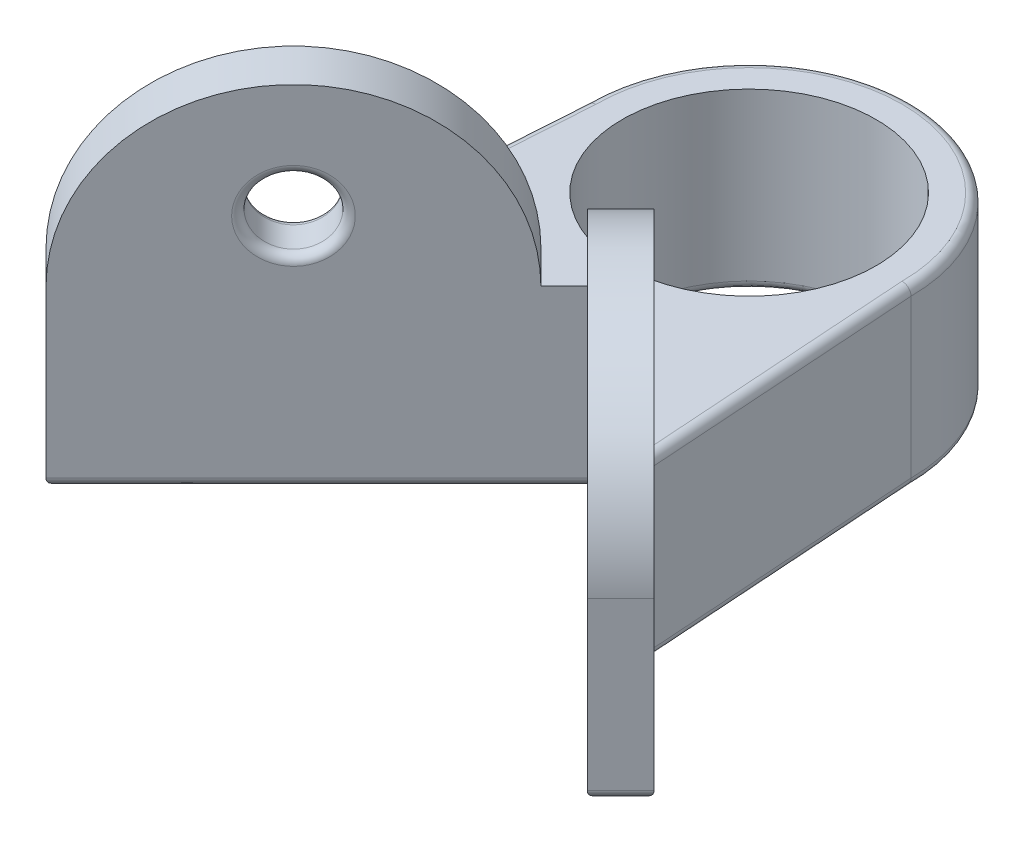
ISO-10303-21;
HEADER;
FILE_DESCRIPTION(('STEP AP214'),'2;1');
FILE_NAME('part.step','',(''),(''),'','','');
FILE_SCHEMA(('AUTOMOTIVE_DESIGN { 1 0 10303 214 1 1 1 1 }'));
ENDSEC;
DATA;
#1=APPLICATION_CONTEXT('core data for automotive mechanical design processes');
#2=APPLICATION_PROTOCOL_DEFINITION('international standard','automotive_design',2000,#1);
#3=PRODUCT_CONTEXT('',#1,'mechanical');
#4=PRODUCT('Part','Part','',(#3));
#5=PRODUCT_RELATED_PRODUCT_CATEGORY('part','',(#4));
#6=PRODUCT_DEFINITION_FORMATION('','',#4);
#7=PRODUCT_DEFINITION_CONTEXT('part definition',#1,'design');
#8=PRODUCT_DEFINITION('design','',#6,#7);
#9=PRODUCT_DEFINITION_SHAPE('','',#8);
#10=(LENGTH_UNIT() NAMED_UNIT(*) SI_UNIT(.MILLI.,.METRE.));
#11=(NAMED_UNIT(*) PLANE_ANGLE_UNIT() SI_UNIT($,.RADIAN.));
#12=(NAMED_UNIT(*) SI_UNIT($,.STERADIAN.) SOLID_ANGLE_UNIT());
#13=UNCERTAINTY_MEASURE_WITH_UNIT(LENGTH_MEASURE(1.E-05),#10,'distance_accuracy_value','');
#14=(GEOMETRIC_REPRESENTATION_CONTEXT(3) GLOBAL_UNCERTAINTY_ASSIGNED_CONTEXT((#13)) GLOBAL_UNIT_ASSIGNED_CONTEXT((#10,
#11,#12)) REPRESENTATION_CONTEXT('',''));
#15=CARTESIAN_POINT('',(0.,0.,0.));
#16=DIRECTION('',(0.,0.,1.));
#17=DIRECTION('',(1.,0.,0.));
#18=AXIS2_PLACEMENT_3D('',#15,#16,#17);
#19=CARTESIAN_POINT('',(-9.25,0.,9.25000000000004));
#20=DIRECTION('',(-0.707106781186546,0.,0.707106781186549));
#21=DIRECTION('',(0.707106781186549,0.,0.707106781186546));
#22=AXIS2_PLACEMENT_3D('',#19,#20,#21);
#23=PLANE('',#22);
#24=CARTESIAN_POINT('',(16.7907185903655,27.,35.2907185903655));
#25=DIRECTION('',(-0.707106781186546,0.,0.707106781186549));
#26=DIRECTION('',(0.707106781186549,0.,0.707106781186546));
#27=AXIS2_PLACEMENT_3D('',#24,#25,#26);
#28=CIRCLE('',#27,5.);
#29=CARTESIAN_POINT('',(20.3262524962983,27.,38.8262524962982));
#30=VERTEX_POINT('',#29);
#31=EDGE_CURVE('E93',#30,#30,#28,.F.);
#32=ORIENTED_EDGE('',*,*,#31,.T.);
#33=EDGE_LOOP('',(#32));
#34=FACE_BOUND('',#33,.T.);
#35=DIRECTION('',(0.,1.,0.));
#36=VECTOR('',#35,1.);
#37=CARTESIAN_POINT('',(0.,0.,18.5));
#38=LINE('',#37,#36);
#39=CARTESIAN_POINT('',(0.,1.,18.5));
#40=VERTEX_POINT('',#39);
#41=CARTESIAN_POINT('',(0.,20.,18.5));
#42=VERTEX_POINT('',#41);
#43=EDGE_CURVE('E567',#40,#42,#38,.T.);
#44=ORIENTED_EDGE('',*,*,#43,.F.);
#45=DIRECTION('',(0.707106781186549,0.,0.707106781186546));
#46=VECTOR('',#45,1.);
#47=CARTESIAN_POINT('',(30.9328542140965,1.,49.4328542140964));
#48=LINE('',#47,#46);
#49=CARTESIAN_POINT('',(30.9328542140965,1.,49.4328542140964));
#50=VERTEX_POINT('',#49);
#51=EDGE_CURVE('E529',#40,#50,#48,.T.);
#52=ORIENTED_EDGE('',*,*,#51,.T.);
#53=DIRECTION('',(0.,1.,0.));
#54=VECTOR('',#53,1.);
#55=CARTESIAN_POINT('',(30.9328542140965,0.,49.4328542140964));
#56=LINE('',#55,#54);
#57=CARTESIAN_POINT('',(30.9328542140965,20.,49.4328542140964));
#58=VERTEX_POINT('',#57);
#59=EDGE_CURVE('E609',#50,#58,#56,.T.);
#60=ORIENTED_EDGE('',*,*,#59,.T.);
#61=CARTESIAN_POINT('',(16.8129092861663,20.,35.3129092861663));
#62=DIRECTION('',(-0.707106781186546,0.,0.707106781186549));
#63=DIRECTION('',(0.707106781186549,0.,0.707106781186546));
#64=AXIS2_PLACEMENT_3D('',#61,#62,#63);
#65=CIRCLE('',#64,19.96861761704);
#66=CARTESIAN_POINT('',(2.69296435823619,20.,21.1929643582362));
#67=VERTEX_POINT('',#66);
#68=EDGE_CURVE('E480',#58,#67,#65,.T.);
#69=ORIENTED_EDGE('',*,*,#68,.T.);
#70=DIRECTION('',(0.707106781186548,0.,0.707106781186547));
#71=VECTOR('',#70,1.);
#72=CARTESIAN_POINT('',(0.,20.,18.5));
#73=LINE('',#72,#71);
#74=EDGE_CURVE('E235',#42,#67,#73,.T.);
#75=ORIENTED_EDGE('',*,*,#74,.F.);
#76=EDGE_LOOP('',(#44,#52,#60,#69,#75));
#77=FACE_BOUND('',#76,.T.);
#78=ADVANCED_FACE('F85',(#34,#77),#23,.T.);
#79=CARTESIAN_POINT('',(9.25,0.,9.25000000000003));
#80=DIRECTION('',(-0.707106781186546,0.,-0.707106781186549));
#81=DIRECTION('',(-0.707106781186549,0.,0.707106781186546));
#82=AXIS2_PLACEMENT_3D('',#79,#80,#81);
#83=PLANE('',#82);
#84=CARTESIAN_POINT('',(-16.7907185903655,26.9488438876536,35.2907185903655));
#85=DIRECTION('',(-0.707106781186546,0.,-0.707106781186549));
#86=DIRECTION('',(-0.707106781186549,0.,0.707106781186546));
#87=AXIS2_PLACEMENT_3D('',#84,#85,#86);
#88=CIRCLE('',#87,5.);
#89=CARTESIAN_POINT('',(-20.3262524962983,26.9488438876536,38.8262524962982));
#90=VERTEX_POINT('',#89);
#91=EDGE_CURVE('E422',#90,#90,#88,.T.);
#92=ORIENTED_EDGE('',*,*,#91,.T.);
#93=EDGE_LOOP('',(#92));
#94=FACE_BOUND('',#93,.T.);
#95=DIRECTION('',(0.,1.,0.));
#96=VECTOR('',#95,1.);
#97=CARTESIAN_POINT('',(-30.9328542140965,0.,49.4328542140964));
#98=LINE('',#97,#96);
#99=CARTESIAN_POINT('',(-30.9328542140965,1.,49.4328542140964));
#100=VERTEX_POINT('',#99);
#101=CARTESIAN_POINT('',(-30.9328542140965,19.9488438876536,49.4328542140964));
#102=VERTEX_POINT('',#101);
#103=EDGE_CURVE('E565',#100,#102,#98,.T.);
#104=ORIENTED_EDGE('',*,*,#103,.F.);
#105=DIRECTION('',(-0.707106781186549,0.,0.707106781186546));
#106=VECTOR('',#105,1.);
#107=CARTESIAN_POINT('',(9.25,1.,9.25000000000003));
#108=LINE('',#107,#106);
#109=EDGE_CURVE('E527',#100,#40,#108,.F.);
#110=ORIENTED_EDGE('',*,*,#109,.T.);
#111=ORIENTED_EDGE('',*,*,#43,.T.);
#112=DIRECTION('',(0.707106781186548,0.,-0.707106781186547));
#113=VECTOR('',#112,1.);
#114=CARTESIAN_POINT('',(-2.64858296663456,20.,21.1485829666346));
#115=LINE('',#114,#113);
#116=CARTESIAN_POINT('',(-2.64858296663456,20.,21.1485829666346));
#117=VERTEX_POINT('',#116);
#118=EDGE_CURVE('E245',#117,#42,#115,.T.);
#119=ORIENTED_EDGE('',*,*,#118,.F.);
#120=DIRECTION('',(0.,-1.,0.));
#121=VECTOR('',#120,1.);
#122=CARTESIAN_POINT('',(-2.64858296663456,0.,21.1485829666345));
#123=LINE('',#122,#121);
#124=CARTESIAN_POINT('',(-2.64858296663456,19.9488438876536,21.1485829666345));
#125=VERTEX_POINT('',#124);
#126=EDGE_CURVE('E570',#117,#125,#123,.T.);
#127=ORIENTED_EDGE('',*,*,#126,.T.);
#128=CARTESIAN_POINT('',(-16.7907185903655,19.9488438876536,35.2907185903655));
#129=DIRECTION('',(-0.707106781186546,0.,-0.707106781186549));
#130=DIRECTION('',(-0.707106781186549,0.,0.707106781186546));
#131=AXIS2_PLACEMENT_3D('',#128,#129,#130);
#132=CIRCLE('',#131,20.);
#133=EDGE_CURVE('E263',#125,#102,#132,.F.);
#134=ORIENTED_EDGE('',*,*,#133,.T.);
#135=EDGE_LOOP('',(#104,#110,#111,#119,#127,#134));
#136=FACE_BOUND('',#135,.T.);
#137=ADVANCED_FACE('F301',(#94,#136),#83,.F.);
#138=CARTESIAN_POINT('',(7.67942640343322,19.9488438876536,31.4765923367024));
#139=DIRECTION('',(0.707106781186549,0.,-0.707106781186546));
#140=DIRECTION('',(-0.707106781186546,0.,-0.707106781186549));
#141=AXIS2_PLACEMENT_3D('',#138,#139,#140);
#142=PLANE('',#141);
#143=DIRECTION('',(0.707106781186546,0.,0.707106781186549));
#144=VECTOR('',#143,1.);
#145=CARTESIAN_POINT('',(-6.46270922029771,20.,17.3344567129714));
#146=LINE('',#145,#144);
#147=CARTESIAN_POINT('',(-6.46273235110501,20.,17.3344798437787));
#148=VERTEX_POINT('',#147);
#149=EDGE_CURVE('E483',#148,#117,#146,.T.);
#150=ORIENTED_EDGE('',*,*,#149,.F.);
#151=CARTESIAN_POINT('',(-6.46270922029771,20.,17.3344567129714));
#152=DIRECTION('',(0.,-1.,0.));
#153=VECTOR('',#152,1.);
#154=LINE('',#151,#153);
#155=CARTESIAN_POINT('',(-6.46270922029771,19.9488438876536,17.3344567129714));
#156=VERTEX_POINT('',#155);
#157=EDGE_CURVE('E262',#148,#156,#154,.T.);
#158=ORIENTED_EDGE('',*,*,#157,.T.);
#159=DIRECTION('',(-0.707106781186546,0.,-0.707106781186549));
#160=VECTOR('',#159,1.);
#161=CARTESIAN_POINT('',(7.67942640343322,19.9488438876536,31.4765923367024));
#162=LINE('',#161,#160);
#163=EDGE_CURVE('E274',#125,#156,#162,.T.);
#164=ORIENTED_EDGE('',*,*,#163,.F.);
#165=ORIENTED_EDGE('',*,*,#126,.F.);
#166=EDGE_LOOP('',(#150,#158,#164,#165));
#167=FACE_BOUND('',#166,.T.);
#168=ADVANCED_FACE('F288',(#167),#142,.F.);
#169=CARTESIAN_POINT('',(-5.43587374633685,0.,5.43587374633688));
#170=DIRECTION('',(0.707106781186546,0.,-0.707106781186549));
#171=DIRECTION('',(-0.707106781186549,0.,-0.707106781186546));
#172=AXIS2_PLACEMENT_3D('',#169,#170,#171);
#173=PLANE('',#172);
#174=CARTESIAN_POINT('',(20.6048448440287,27.,31.4765923367023));
#175=DIRECTION('',(0.707106781186546,0.,-0.707106781186549));
#176=DIRECTION('',(-0.707106781186549,0.,-0.707106781186546));
#177=AXIS2_PLACEMENT_3D('',#174,#175,#176);
#178=CIRCLE('',#177,4.);
#179=CARTESIAN_POINT('',(17.7764177192825,27.,28.6481652119561));
#180=VERTEX_POINT('',#179);
#181=EDGE_CURVE('E249',#180,#180,#178,.T.);
#182=ORIENTED_EDGE('',*,*,#181,.F.);
#183=EDGE_LOOP('',(#182));
#184=FACE_BOUND('',#183,.T.);
#185=DIRECTION('',(0.,1.,0.));
#186=VECTOR('',#185,1.);
#187=CARTESIAN_POINT('',(34.7469804677597,0.,45.6187279604332));
#188=LINE('',#187,#186);
#189=CARTESIAN_POINT('',(34.7469804677597,1.,45.6187279604332));
#190=VERTEX_POINT('',#189);
#191=CARTESIAN_POINT('',(34.7469804677597,20.,45.6187279604332));
#192=VERTEX_POINT('',#191);
#193=EDGE_CURVE('E574',#190,#192,#188,.T.);
#194=ORIENTED_EDGE('',*,*,#193,.F.);
#195=DIRECTION('',(-0.707106781186549,0.,-0.707106781186546));
#196=VECTOR('',#195,1.);
#197=CARTESIAN_POINT('',(20.6048448440287,1.,31.4765923367023));
#198=LINE('',#197,#196);
#199=CARTESIAN_POINT('',(20.6048448440287,1.,31.4765923367023));
#200=VERTEX_POINT('',#199);
#201=EDGE_CURVE('E515',#190,#200,#198,.T.);
#202=ORIENTED_EDGE('',*,*,#201,.T.);
#203=DIRECTION('',(0.,1.,0.));
#204=VECTOR('',#203,1.);
#205=CARTESIAN_POINT('',(20.6048448440287,0.,31.4765923367023));
#206=LINE('',#205,#204);
#207=CARTESIAN_POINT('',(20.6048448440287,19.,31.4765923367023));
#208=VERTEX_POINT('',#207);
#209=EDGE_CURVE('E226',#200,#208,#206,.T.);
#210=ORIENTED_EDGE('',*,*,#209,.T.);
#211=CARTESIAN_POINT('',(19.5307892569355,19.,30.4025367496091));
#212=DIRECTION('',(0.707106781186546,0.,-0.707106781186549));
#213=DIRECTION('',(-0.707106781186549,0.,-0.707106781186546));
#214=AXIS2_PLACEMENT_3D('',#211,#212,#213);
#215=ELLIPSE('',#214,1.51894397800982,1.);
#216=CARTESIAN_POINT('',(19.5307892569355,20.,30.4025367496091));
#217=VERTEX_POINT('',#216);
#218=EDGE_CURVE('E223',#208,#217,#215,.F.);
#219=ORIENTED_EDGE('',*,*,#218,.T.);
#220=DIRECTION('',(-0.707106781186549,0.,-0.707106781186546));
#221=VECTOR('',#220,1.);
#222=CARTESIAN_POINT('',(-5.43587374633685,20.,5.43587374633688));
#223=LINE('',#222,#221);
#224=CARTESIAN_POINT('',(6.50709061189934,20.,17.378838104573));
#225=VERTEX_POINT('',#224);
#226=EDGE_CURVE('E216',#217,#225,#223,.T.);
#227=ORIENTED_EDGE('',*,*,#226,.T.);
#228=CARTESIAN_POINT('',(20.6270355398295,20.,31.4987830325031));
#229=DIRECTION('',(0.707106781186546,0.,-0.707106781186549));
#230=DIRECTION('',(-0.707106781186549,0.,-0.707106781186546));
#231=AXIS2_PLACEMENT_3D('',#228,#229,#230);
#232=CIRCLE('',#231,19.96861761704);
#233=EDGE_CURVE('E221',#225,#192,#232,.T.);
#234=ORIENTED_EDGE('',*,*,#233,.T.);
#235=EDGE_LOOP('',(#194,#202,#210,#219,#227,#234));
#236=FACE_BOUND('',#235,.T.);
#237=ADVANCED_FACE('F219',(#184,#236),#173,.T.);
#238=CARTESIAN_POINT('',(-40.1828542140965,0.,40.1828542140964));
#239=DIRECTION('',(0.707106781186548,0.,-0.707106781186547));
#240=DIRECTION('',(-0.707106781186547,0.,-0.707106781186548));
#241=AXIS2_PLACEMENT_3D('',#238,#239,#240);
#242=PLANE('',#241);
#243=DIRECTION('',(0.,1.,0.));
#244=VECTOR('',#243,1.);
#245=CARTESIAN_POINT('',(-34.7469804677596,0.,45.6187279604333));
#246=LINE('',#245,#244);
#247=CARTESIAN_POINT('',(-34.7469804677596,1.,45.6187279604333));
#248=VERTEX_POINT('',#247);
#249=CARTESIAN_POINT('',(-34.7469804677597,19.9488438876536,45.6187279604332));
#250=VERTEX_POINT('',#249);
#251=EDGE_CURVE('E560',#248,#250,#246,.T.);
#252=ORIENTED_EDGE('',*,*,#251,.F.);
#253=DIRECTION('',(-0.707106781186547,0.,-0.707106781186548));
#254=VECTOR('',#253,1.);
#255=CARTESIAN_POINT('',(-40.1828542140965,1.,40.1828542140964));
#256=LINE('',#255,#254);
#257=EDGE_CURVE('E525',#248,#100,#256,.F.);
#258=ORIENTED_EDGE('',*,*,#257,.T.);
#259=ORIENTED_EDGE('',*,*,#103,.T.);
#260=DIRECTION('',(-0.707106781186546,0.,-0.707106781186549));
#261=VECTOR('',#260,1.);
#262=CARTESIAN_POINT('',(-20.6048448440287,19.9488438876536,59.7608635841642));
#263=LINE('',#262,#261);
#264=EDGE_CURVE('E564',#102,#250,#263,.T.);
#265=ORIENTED_EDGE('',*,*,#264,.T.);
#266=EDGE_LOOP('',(#252,#258,#259,#265));
#267=FACE_BOUND('',#266,.T.);
#268=ADVANCED_FACE('F293',(#267),#242,.F.);
#269=CARTESIAN_POINT('',(0.,20.,0.));
#270=DIRECTION('',(0.,1.,0.));
#271=DIRECTION('',(0.,0.,1.));
#272=AXIS2_PLACEMENT_3D('',#269,#270,#271);
#273=PLANE('',#272);
#274=ORIENTED_EDGE('',*,*,#226,.F.);
#275=DIRECTION('',(0.0667211531018198,0.,0.997771661117294));
#276=VECTOR('',#275,1.);
#277=CARTESIAN_POINT('',(17.5022283388827,20.,0.0667211531017752));
#278=LINE('',#277,#276);
#279=CARTESIAN_POINT('',(17.4999690093748,20.,0.0329343426025184));
#280=VERTEX_POINT('',#279);
#281=EDGE_CURVE('E460',#217,#280,#278,.F.);
#282=ORIENTED_EDGE('',*,*,#281,.T.);
#283=CARTESIAN_POINT('',(0.,20.,0.));
#284=DIRECTION('',(0.,1.,0.));
#285=DIRECTION('',(0.,0.,1.));
#286=AXIS2_PLACEMENT_3D('',#283,#284,#285);
#287=CIRCLE('',#286,17.5);
#288=CARTESIAN_POINT('',(-17.4999690093748,20.,0.0329343426024631));
#289=VERTEX_POINT('',#288);
#290=EDGE_CURVE('E464',#280,#289,#287,.T.);
#291=ORIENTED_EDGE('',*,*,#290,.T.);
#292=DIRECTION('',(-0.0667211531018193,0.,0.997771661117294));
#293=VECTOR('',#292,1.);
#294=CARTESIAN_POINT('',(-17.4198716618648,20.,-1.16486964849636));
#295=LINE('',#294,#293);
#296=CARTESIAN_POINT('',(-19.5307892569355,20.,30.4025367496091));
#297=VERTEX_POINT('',#296);
#298=EDGE_CURVE('E462',#289,#297,#295,.T.);
#299=ORIENTED_EDGE('',*,*,#298,.T.);
#300=DIRECTION('',(0.707106781186548,0.,-0.707106781186547));
#301=VECTOR('',#300,1.);
#302=CARTESIAN_POINT('',(5.43587374633685,20.,5.43587374633686));
#303=LINE('',#302,#301);
#304=EDGE_CURVE('E467',#297,#148,#303,.T.);
#305=ORIENTED_EDGE('',*,*,#304,.T.);
#306=ORIENTED_EDGE('',*,*,#149,.T.);
#307=ORIENTED_EDGE('',*,*,#118,.T.);
#308=ORIENTED_EDGE('',*,*,#74,.T.);
#309=DIRECTION('',(0.707106781186546,0.,-0.707106781186549));
#310=VECTOR('',#309,1.);
#311=CARTESIAN_POINT('',(-7.63504501183158,20.,31.520973728304));
#312=LINE('',#311,#310);
#313=EDGE_CURVE('E230',#67,#225,#312,.T.);
#314=ORIENTED_EDGE('',*,*,#313,.T.);
#315=EDGE_LOOP('',(#274,#282,#291,#299,#305,#306,#307,#308,#314));
#316=FACE_BOUND('',#315,.T.);
#317=CARTESIAN_POINT('',(0.,20.,0.));
#318=DIRECTION('',(0.,1.,0.));
#319=DIRECTION('',(0.,0.,1.));
#320=AXIS2_PLACEMENT_3D('',#317,#318,#319);
#321=CIRCLE('',#320,14.5);
#322=CARTESIAN_POINT('',(0.,20.,14.5));
#323=VERTEX_POINT('',#322);
#324=EDGE_CURVE('E476',#323,#323,#321,.T.);
#325=ORIENTED_EDGE('',*,*,#324,.F.);
#326=EDGE_LOOP('',(#325));
#327=FACE_BOUND('',#326,.T.);
#328=ADVANCED_FACE('F231',(#316,#327),#273,.T.);
#329=CARTESIAN_POINT('',(0.,20.,0.));
#330=DIRECTION('',(0.,-1.,0.));
#331=DIRECTION('',(0.,0.,-1.));
#332=AXIS2_PLACEMENT_3D('',#329,#330,#331);
#333=CYLINDRICAL_SURFACE('',#332,18.5);
#334=DIRECTION('',(0.,1.,0.));
#335=VECTOR('',#334,1.);
#336=CARTESIAN_POINT('',(-18.5,0.,0.));
#337=LINE('',#336,#335);
#338=CARTESIAN_POINT('',(-18.5,1.,0.));
#339=VERTEX_POINT('',#338);
#340=CARTESIAN_POINT('',(-18.5,19.,0.));
#341=VERTEX_POINT('',#340);
#342=EDGE_CURVE('E470',#339,#341,#337,.T.);
#343=ORIENTED_EDGE('',*,*,#342,.T.);
#344=CARTESIAN_POINT('',(0.,19.,0.));
#345=DIRECTION('',(0.,1.,0.));
#346=DIRECTION('',(0.,0.,1.));
#347=AXIS2_PLACEMENT_3D('',#344,#345,#346);
#348=CIRCLE('',#347,18.5);
#349=CARTESIAN_POINT('',(18.5,19.,0.));
#350=VERTEX_POINT('',#349);
#351=EDGE_CURVE('E455',#341,#350,#348,.F.);
#352=ORIENTED_EDGE('',*,*,#351,.T.);
#353=DIRECTION('',(0.,1.,0.));
#354=VECTOR('',#353,1.);
#355=CARTESIAN_POINT('',(18.5,0.,0.));
#356=LINE('',#355,#354);
#357=CARTESIAN_POINT('',(18.5,1.,0.));
#358=VERTEX_POINT('',#357);
#359=EDGE_CURVE('E227',#358,#350,#356,.T.);
#360=ORIENTED_EDGE('',*,*,#359,.F.);
#361=CARTESIAN_POINT('',(0.,1.,0.));
#362=DIRECTION('',(0.,1.,0.));
#363=DIRECTION('',(0.,0.,1.));
#364=AXIS2_PLACEMENT_3D('',#361,#362,#363);
#365=CIRCLE('',#364,18.5);
#366=EDGE_CURVE('E519',#358,#339,#365,.T.);
#367=ORIENTED_EDGE('',*,*,#366,.T.);
#368=EDGE_LOOP('',(#343,#352,#360,#367));
#369=FACE_BOUND('',#368,.T.);
#370=ADVANCED_FACE('F326',(#369),#333,.T.);
#371=CARTESIAN_POINT('',(0.,0.,0.));
#372=DIRECTION('',(0.,1.,0.));
#373=DIRECTION('',(0.,0.,1.));
#374=AXIS2_PLACEMENT_3D('',#371,#372,#373);
#375=PLANE('',#374);
#376=CARTESIAN_POINT('',(0.,0.,0.));
#377=DIRECTION('',(0.,1.,0.));
#378=DIRECTION('',(0.,0.,1.));
#379=AXIS2_PLACEMENT_3D('',#376,#377,#378);
#380=CIRCLE('',#379,15.5);
#381=CARTESIAN_POINT('',(0.,0.,15.5));
#382=VERTEX_POINT('',#381);
#383=EDGE_CURVE('E506',#382,#382,#380,.T.);
#384=ORIENTED_EDGE('',*,*,#383,.T.);
#385=EDGE_LOOP('',(#384));
#386=FACE_BOUND('',#385,.T.);
#387=DIRECTION('',(-0.707106781186549,0.,-0.707106781186546));
#388=VECTOR('',#387,1.);
#389=CARTESIAN_POINT('',(34.0398736865731,0.,46.3258347416198));
#390=LINE('',#389,#388);
#391=CARTESIAN_POINT('',(19.6321349506454,0.,31.9180960056921));
#392=VERTEX_POINT('',#391);
#393=CARTESIAN_POINT('',(33.3327669053866,0.,45.6187279604332));
#394=VERTEX_POINT('',#393);
#395=EDGE_CURVE('E501',#392,#394,#390,.F.);
#396=ORIENTED_EDGE('',*,*,#395,.T.);
#397=DIRECTION('',(0.707106781186546,0.,-0.707106781186549));
#398=VECTOR('',#397,1.);
#399=CARTESIAN_POINT('',(30.22574743291,0.,48.7257474329098));
#400=LINE('',#399,#398);
#401=CARTESIAN_POINT('',(30.9328542140965,0.,48.0186406517233));
#402=VERTEX_POINT('',#401);
#403=EDGE_CURVE('E503',#394,#402,#400,.F.);
#404=ORIENTED_EDGE('',*,*,#403,.T.);
#405=DIRECTION('',(0.707106781186549,0.,0.707106781186546));
#406=VECTOR('',#405,1.);
#407=CARTESIAN_POINT('',(0.707106781186545,0.,17.7928932188135));
#408=LINE('',#407,#406);
#409=CARTESIAN_POINT('',(0.,0.,17.0857864376269));
#410=VERTEX_POINT('',#409);
#411=EDGE_CURVE('E482',#402,#410,#408,.F.);
#412=ORIENTED_EDGE('',*,*,#411,.T.);
#413=DIRECTION('',(-0.707106781186549,0.,0.707106781186546));
#414=VECTOR('',#413,1.);
#415=CARTESIAN_POINT('',(8.54289321881345,0.,8.54289321881348));
#416=LINE('',#415,#414);
#417=CARTESIAN_POINT('',(-30.9328542140965,0.,48.0186406517233));
#418=VERTEX_POINT('',#417);
#419=EDGE_CURVE('E489',#410,#418,#416,.T.);
#420=ORIENTED_EDGE('',*,*,#419,.T.);
#421=DIRECTION('',(-0.707106781186547,0.,-0.707106781186548));
#422=VECTOR('',#421,1.);
#423=CARTESIAN_POINT('',(-39.4757474329099,0.,39.4757474329099));
#424=LINE('',#423,#422);
#425=CARTESIAN_POINT('',(-33.3327669053865,0.,45.6187279604333));
#426=VERTEX_POINT('',#425);
#427=EDGE_CURVE('E491',#418,#426,#424,.T.);
#428=ORIENTED_EDGE('',*,*,#427,.T.);
#429=DIRECTION('',(0.707106781186548,0.,-0.707106781186547));
#430=VECTOR('',#429,1.);
#431=CARTESIAN_POINT('',(6.14298052752339,0.,6.14298052752341));
#432=LINE('',#431,#430);
#433=CARTESIAN_POINT('',(-19.6321349506453,0.,31.9180960056921));
#434=VERTEX_POINT('',#433);
#435=EDGE_CURVE('E493',#426,#434,#432,.T.);
#436=ORIENTED_EDGE('',*,*,#435,.T.);
#437=DIRECTION('',(-0.0667211531018193,0.,0.997771661117294));
#438=VECTOR('',#437,1.);
#439=CARTESIAN_POINT('',(-17.5022283388827,0.,0.0667211531017846));
#440=LINE('',#439,#438);
#441=CARTESIAN_POINT('',(-17.4999690093748,0.,0.0329343426024758));
#442=VERTEX_POINT('',#441);
#443=EDGE_CURVE('E495',#434,#442,#440,.F.);
#444=ORIENTED_EDGE('',*,*,#443,.T.);
#445=CARTESIAN_POINT('',(0.,0.,0.));
#446=DIRECTION('',(0.,1.,0.));
#447=DIRECTION('',(0.,0.,1.));
#448=AXIS2_PLACEMENT_3D('',#445,#446,#447);
#449=CIRCLE('',#448,17.5);
#450=CARTESIAN_POINT('',(17.4999690093748,0.,0.0329343426025104));
#451=VERTEX_POINT('',#450);
#452=EDGE_CURVE('E497',#442,#451,#449,.F.);
#453=ORIENTED_EDGE('',*,*,#452,.T.);
#454=DIRECTION('',(0.0667211531018198,0.,0.997771661117294));
#455=VECTOR('',#454,1.);
#456=CARTESIAN_POINT('',(17.4198716618648,0.,-1.16486964849636));
#457=LINE('',#456,#455);
#458=EDGE_CURVE('E499',#451,#392,#457,.T.);
#459=ORIENTED_EDGE('',*,*,#458,.T.);
#460=EDGE_LOOP('',(#396,#404,#412,#420,#428,#436,#444,#453,#459));
#461=FACE_BOUND('',#460,.T.);
#462=ADVANCED_FACE('F322',(#386,#461),#375,.F.);
#463=CARTESIAN_POINT('',(0.,20.,0.));
#464=DIRECTION('',(0.,-1.,0.));
#465=DIRECTION('',(0.,0.,-1.));
#466=AXIS2_PLACEMENT_3D('',#463,#464,#465);
#467=CYLINDRICAL_SURFACE('',#466,14.5);
#468=CARTESIAN_POINT('',(0.,1.,0.));
#469=DIRECTION('',(0.,1.,0.));
#470=DIRECTION('',(0.,0.,1.));
#471=AXIS2_PLACEMENT_3D('',#468,#469,#470);
#472=CIRCLE('',#471,14.5);
#473=CARTESIAN_POINT('',(0.,1.,14.5));
#474=VERTEX_POINT('',#473);
#475=EDGE_CURVE('E509',#474,#474,#472,.F.);
#476=ORIENTED_EDGE('',*,*,#475,.T.);
#477=EDGE_LOOP('',(#476));
#478=FACE_BOUND('',#477,.T.);
#479=ORIENTED_EDGE('',*,*,#324,.T.);
#480=EDGE_LOOP('',(#479));
#481=FACE_BOUND('',#480,.T.);
#482=ADVANCED_FACE('F319',(#478,#481),#467,.F.);
#483=CARTESIAN_POINT('',(-18.4176433229821,0.,-1.23159080159817));
#484=DIRECTION('',(-0.997771661117294,0.,-0.0667211531018193));
#485=DIRECTION('',(-0.0667211531018193,0.,0.997771661117294));
#486=AXIS2_PLACEMENT_3D('',#483,#484,#485);
#487=PLANE('',#486);
#488=DIRECTION('',(0.,1.,0.));
#489=VECTOR('',#488,1.);
#490=CARTESIAN_POINT('',(-20.6048448440287,0.,31.4765923367023));
#491=LINE('',#490,#489);
#492=CARTESIAN_POINT('',(-20.6048448440287,1.,31.4765923367023));
#493=VERTEX_POINT('',#492);
#494=CARTESIAN_POINT('',(-20.6048448440287,19.,31.4765923367023));
#495=VERTEX_POINT('',#494);
#496=EDGE_CURVE('E474',#493,#495,#491,.T.);
#497=ORIENTED_EDGE('',*,*,#496,.T.);
#498=DIRECTION('',(-0.0667211531018193,0.,0.997771661117294));
#499=VECTOR('',#498,1.);
#500=CARTESIAN_POINT('',(-18.4176433229821,19.,-1.23159080159817));
#501=LINE('',#500,#499);
#502=EDGE_CURVE('E107',#495,#341,#501,.F.);
#503=ORIENTED_EDGE('',*,*,#502,.T.);
#504=ORIENTED_EDGE('',*,*,#342,.F.);
#505=DIRECTION('',(-0.0667211531018193,0.,0.997771661117294));
#506=VECTOR('',#505,1.);
#507=CARTESIAN_POINT('',(-20.6048448440287,1.,31.4765923367023));
#508=LINE('',#507,#506);
#509=EDGE_CURVE('E521',#339,#493,#508,.T.);
#510=ORIENTED_EDGE('',*,*,#509,.T.);
#511=EDGE_LOOP('',(#497,#503,#504,#510));
#512=FACE_BOUND('',#511,.T.);
#513=ADVANCED_FACE('F315',(#512),#487,.T.);
#514=CARTESIAN_POINT('',(18.4176433229821,0.,-1.23159080159818));
#515=DIRECTION('',(-0.997771661117294,0.,0.0667211531018198));
#516=DIRECTION('',(0.0667211531018198,0.,0.997771661117294));
#517=AXIS2_PLACEMENT_3D('',#514,#515,#516);
#518=PLANE('',#517);
#519=ORIENTED_EDGE('',*,*,#359,.T.);
#520=DIRECTION('',(0.0667211531018198,0.,0.997771661117294));
#521=VECTOR('',#520,1.);
#522=CARTESIAN_POINT('',(20.6048448440287,19.,31.4765923367023));
#523=LINE('',#522,#521);
#524=EDGE_CURVE('E466',#350,#208,#523,.T.);
#525=ORIENTED_EDGE('',*,*,#524,.T.);
#526=ORIENTED_EDGE('',*,*,#209,.F.);
#527=DIRECTION('',(0.0667211531018198,0.,0.997771661117294));
#528=VECTOR('',#527,1.);
#529=CARTESIAN_POINT('',(18.4176433229821,1.,-1.23159080159818));
#530=LINE('',#529,#528);
#531=EDGE_CURVE('E517',#200,#358,#530,.F.);
#532=ORIENTED_EDGE('',*,*,#531,.T.);
#533=EDGE_LOOP('',(#519,#525,#526,#532));
#534=FACE_BOUND('',#533,.T.);
#535=ADVANCED_FACE('F311',(#534),#518,.F.);
#536=CARTESIAN_POINT('',(5.43587374633685,0.,5.43587374633686));
#537=DIRECTION('',(0.707106781186547,0.,0.707106781186548));
#538=DIRECTION('',(0.707106781186548,0.,-0.707106781186547));
#539=AXIS2_PLACEMENT_3D('',#536,#537,#538);
#540=PLANE('',#539);
#541=CARTESIAN_POINT('',(-20.6048448440287,26.9488438876536,31.4765923367023));
#542=DIRECTION('',(0.707106781186547,0.,0.707106781186548));
#543=DIRECTION('',(0.707106781186548,0.,-0.707106781186547));
#544=AXIS2_PLACEMENT_3D('',#541,#542,#543);
#545=CIRCLE('',#544,5.);
#546=CARTESIAN_POINT('',(-17.0693109380959,26.9488438876536,27.9410584307696));
#547=VERTEX_POINT('',#546);
#548=EDGE_CURVE('E12',#547,#547,#545,.T.);
#549=ORIENTED_EDGE('',*,*,#548,.T.);
#550=EDGE_LOOP('',(#549));
#551=FACE_BOUND('',#550,.T.);
#552=ORIENTED_EDGE('',*,*,#496,.F.);
#553=DIRECTION('',(0.707106781186548,0.,-0.707106781186547));
#554=VECTOR('',#553,1.);
#555=CARTESIAN_POINT('',(5.43587374633685,1.,5.43587374633686));
#556=LINE('',#555,#554);
#557=EDGE_CURVE('E523',#493,#248,#556,.F.);
#558=ORIENTED_EDGE('',*,*,#557,.T.);
#559=ORIENTED_EDGE('',*,*,#251,.T.);
#560=CARTESIAN_POINT('',(-20.6048448440287,19.9488438876536,31.4765923367023));
#561=DIRECTION('',(0.707106781186546,0.,0.707106781186549));
#562=DIRECTION('',(-0.707106781186549,0.,0.707106781186546));
#563=AXIS2_PLACEMENT_3D('',#560,#561,#562);
#564=CIRCLE('',#563,20.);
#565=EDGE_CURVE('E253',#148,#250,#564,.T.);
#566=ORIENTED_EDGE('',*,*,#565,.F.);
#567=ORIENTED_EDGE('',*,*,#304,.F.);
#568=CARTESIAN_POINT('',(-19.5307892569355,19.,30.4025367496091));
#569=DIRECTION('',(0.707106781186547,0.,0.707106781186548));
#570=DIRECTION('',(-0.707106781186548,0.,0.707106781186547));
#571=AXIS2_PLACEMENT_3D('',#568,#569,#570);
#572=ELLIPSE('',#571,1.51894397800982,1.);
#573=EDGE_CURVE('E100',#297,#495,#572,.T.);
#574=ORIENTED_EDGE('',*,*,#573,.T.);
#575=EDGE_LOOP('',(#552,#558,#559,#566,#567,#574));
#576=FACE_BOUND('',#575,.T.);
#577=ADVANCED_FACE('F297',(#551,#576),#540,.F.);
#578=CARTESIAN_POINT('',(40.1828542140965,0.,40.1828542140963));
#579=DIRECTION('',(0.707106781186549,0.,0.707106781186546));
#580=DIRECTION('',(0.707106781186546,0.,-0.707106781186549));
#581=AXIS2_PLACEMENT_3D('',#578,#579,#580);
#582=PLANE('',#581);
#583=ORIENTED_EDGE('',*,*,#59,.F.);
#584=DIRECTION('',(0.707106781186546,0.,-0.707106781186549));
#585=VECTOR('',#584,1.);
#586=CARTESIAN_POINT('',(34.7469804677597,1.,45.6187279604332));
#587=LINE('',#586,#585);
#588=EDGE_CURVE('E512',#50,#190,#587,.T.);
#589=ORIENTED_EDGE('',*,*,#588,.T.);
#590=ORIENTED_EDGE('',*,*,#193,.T.);
#591=DIRECTION('',(0.707106781186546,0.,-0.707106781186549));
#592=VECTOR('',#591,1.);
#593=CARTESIAN_POINT('',(20.6048448440288,20.,59.7608635841642));
#594=LINE('',#593,#592);
#595=EDGE_CURVE('E239',#58,#192,#594,.T.);
#596=ORIENTED_EDGE('',*,*,#595,.F.);
#597=EDGE_LOOP('',(#583,#589,#590,#596));
#598=FACE_BOUND('',#597,.T.);
#599=ADVANCED_FACE('F287',(#598),#582,.T.);
#600=CARTESIAN_POINT('',(-6.46270922029776,19.9488438876536,45.6187279604333));
#601=DIRECTION('',(-0.707106781186546,0.,-0.707106781186549));
#602=DIRECTION('',(-0.707106781186549,0.,0.707106781186546));
#603=AXIS2_PLACEMENT_3D('',#600,#601,#602);
#604=CYLINDRICAL_SURFACE('',#603,20.);
#605=ORIENTED_EDGE('',*,*,#163,.T.);
#606=ORIENTED_EDGE('',*,*,#157,.F.);
#607=ORIENTED_EDGE('',*,*,#565,.T.);
#608=ORIENTED_EDGE('',*,*,#264,.F.);
#609=ORIENTED_EDGE('',*,*,#133,.F.);
#610=EDGE_LOOP('',(#605,#606,#607,#608,#609));
#611=FACE_BOUND('',#610,.T.);
#612=ADVANCED_FACE('F276',(#611),#604,.T.);
#613=CARTESIAN_POINT('',(-6.46270922029776,26.9488438876536,45.6187279604333));
#614=DIRECTION('',(-0.707106781186546,0.,-0.707106781186549));
#615=DIRECTION('',(-0.707106781186549,0.,0.707106781186546));
#616=AXIS2_PLACEMENT_3D('',#613,#614,#615);
#617=CYLINDRICAL_SURFACE('',#616,4.);
#618=CARTESIAN_POINT('',(-17.4978253715521,26.9488438876536,34.5836118091789));
#619=DIRECTION('',(-0.707106781186546,0.,-0.707106781186549));
#620=DIRECTION('',(-0.707106781186549,0.,0.707106781186546));
#621=AXIS2_PLACEMENT_3D('',#618,#619,#620);
#622=CIRCLE('',#621,4.);
#623=CARTESIAN_POINT('',(-20.3262524962983,26.9488438876536,37.4120389339251));
#624=VERTEX_POINT('',#623);
#625=EDGE_CURVE('E445',#624,#624,#622,.F.);
#626=ORIENTED_EDGE('',*,*,#625,.T.);
#627=EDGE_LOOP('',(#626));
#628=FACE_BOUND('',#627,.T.);
#629=CARTESIAN_POINT('',(-19.8977380628421,26.9488438876536,32.1836991178889));
#630=DIRECTION('',(0.707106781186547,0.,0.707106781186548));
#631=DIRECTION('',(0.707106781186548,0.,-0.707106781186547));
#632=AXIS2_PLACEMENT_3D('',#629,#630,#631);
#633=CIRCLE('',#632,4.);
#634=CARTESIAN_POINT('',(-17.0693109380959,26.9488438876536,29.3552719931427));
#635=VERTEX_POINT('',#634);
#636=EDGE_CURVE('E448',#635,#635,#633,.F.);
#637=ORIENTED_EDGE('',*,*,#636,.T.);
#638=EDGE_LOOP('',(#637));
#639=FACE_BOUND('',#638,.T.);
#640=ADVANCED_FACE('F286',(#628,#639),#617,.F.);
#641=CARTESIAN_POINT('',(6.48489991609859,20.,45.6409186562341));
#642=DIRECTION('',(0.707106781186546,0.,-0.707106781186549));
#643=DIRECTION('',(-0.707106781186549,0.,-0.707106781186546));
#644=AXIS2_PLACEMENT_3D('',#641,#642,#643);
#645=CYLINDRICAL_SURFACE('',#644,19.96861761704);
#646=ORIENTED_EDGE('',*,*,#595,.T.);
#647=ORIENTED_EDGE('',*,*,#233,.F.);
#648=ORIENTED_EDGE('',*,*,#313,.F.);
#649=ORIENTED_EDGE('',*,*,#68,.F.);
#650=EDGE_LOOP('',(#646,#647,#648,#649));
#651=FACE_BOUND('',#650,.T.);
#652=ADVANCED_FACE('F242',(#651),#645,.T.);
#653=CARTESIAN_POINT('',(6.46270922029778,27.,45.6187279604333));
#654=DIRECTION('',(0.707106781186546,0.,-0.707106781186549));
#655=DIRECTION('',(-0.707106781186549,0.,-0.707106781186546));
#656=AXIS2_PLACEMENT_3D('',#653,#654,#655);
#657=CYLINDRICAL_SURFACE('',#656,4.);
#658=CARTESIAN_POINT('',(17.4978253715521,27.,34.5836118091789));
#659=DIRECTION('',(-0.707106781186546,0.,0.707106781186549));
#660=DIRECTION('',(0.707106781186549,0.,0.707106781186546));
#661=AXIS2_PLACEMENT_3D('',#658,#659,#660);
#662=CIRCLE('',#661,4.);
#663=CARTESIAN_POINT('',(20.3262524962983,27.,37.4120389339251));
#664=VERTEX_POINT('',#663);
#665=EDGE_CURVE('E443',#664,#664,#662,.T.);
#666=ORIENTED_EDGE('',*,*,#665,.T.);
#667=EDGE_LOOP('',(#666));
#668=FACE_BOUND('',#667,.T.);
#669=ORIENTED_EDGE('',*,*,#181,.T.);
#670=EDGE_LOOP('',(#669));
#671=FACE_BOUND('',#670,.T.);
#672=ADVANCED_FACE('F337',(#668,#671),#657,.F.);
#673=CARTESIAN_POINT('',(0.,1.,0.));
#674=DIRECTION('',(0.,1.,0.));
#675=DIRECTION('',(0.,0.,1.));
#676=AXIS2_PLACEMENT_3D('',#673,#674,#675);
#677=TOROIDAL_SURFACE('',#676,15.5,1.);
#678=ORIENTED_EDGE('',*,*,#475,.F.);
#679=EDGE_LOOP('',(#678));
#680=FACE_BOUND('',#679,.T.);
#681=ORIENTED_EDGE('',*,*,#383,.F.);
#682=EDGE_LOOP('',(#681));
#683=FACE_BOUND('',#682,.T.);
#684=ADVANCED_FACE('F333',(#680,#683),#677,.T.);
#685=CARTESIAN_POINT('',(6.14298052752339,1.,6.14298052752341));
#686=DIRECTION('',(0.707106781186548,0.,-0.707106781186547));
#687=DIRECTION('',(-0.707106781186547,0.,-0.707106781186548));
#688=AXIS2_PLACEMENT_3D('',#685,#686,#687);
#689=CYLINDRICAL_SURFACE('',#688,1.);
#690=CARTESIAN_POINT('',(-33.3327669053866,1.,45.6187279604333));
#691=DIRECTION('',(0.,0.,-1.));
#692=DIRECTION('',(-1.,0.,0.));
#693=AXIS2_PLACEMENT_3D('',#690,#691,#692);
#694=ELLIPSE('',#693,1.4142135623731,1.);
#695=EDGE_CURVE('E383',#248,#426,#694,.F.);
#696=ORIENTED_EDGE('',*,*,#695,.F.);
#697=ORIENTED_EDGE('',*,*,#557,.F.);
#698=CARTESIAN_POINT('',(-19.6321349506453,1.,31.9180960056921));
#699=DIRECTION('',(0.413308524080425,0.,-0.910591051967051));
#700=DIRECTION('',(-0.910591051967051,0.,-0.413308524080425));
#701=AXIS2_PLACEMENT_3D('',#698,#699,#700);
#702=ELLIPSE('',#701,1.06821815488094,1.);
#703=EDGE_CURVE('E485',#434,#493,#702,.T.);
#704=ORIENTED_EDGE('',*,*,#703,.F.);
#705=ORIENTED_EDGE('',*,*,#435,.F.);
#706=EDGE_LOOP('',(#696,#697,#704,#705));
#707=FACE_BOUND('',#706,.T.);
#708=ADVANCED_FACE('F336',(#707),#689,.T.);
#709=CARTESIAN_POINT('',(-17.4198716618648,1.,-1.16486964849635));
#710=DIRECTION('',(0.0667211531018193,0.,-0.997771661117294));
#711=DIRECTION('',(-0.997771661117294,0.,-0.0667211531018193));
#712=AXIS2_PLACEMENT_3D('',#709,#710,#711);
#713=CYLINDRICAL_SURFACE('',#712,1.);
#714=ORIENTED_EDGE('',*,*,#703,.T.);
#715=ORIENTED_EDGE('',*,*,#509,.F.);
#716=CARTESIAN_POINT('',(-18.5,1.,0.));
#717=CARTESIAN_POINT('',(-18.4999998201142,0.971877723573197,-1.82690913108768E-10));
#718=CARTESIAN_POINT('',(-18.498812961178,0.943768924565374,3.96451515017965E-05));
#719=CARTESIAN_POINT('',(-18.4940781494595,0.887752536665746,0.000197764606145719));
#720=CARTESIAN_POINT('',(-18.4905303121828,0.859844937998185,0.000316234870266442));
#721=CARTESIAN_POINT('',(-18.4763786145276,0.776769582293628,0.000788692751667957));
#722=CARTESIAN_POINT('',(-18.4622664779458,0.722158469938739,0.0012597307920934));
#723=CARTESIAN_POINT('',(-18.4250798492226,0.616083928636099,0.00249978122702752));
#724=CARTESIAN_POINT('',(-18.402001118774,0.564622001572333,0.00326893453350077));
#725=CARTESIAN_POINT('',(-18.3475421211923,0.466308788867014,0.00508154781176424));
#726=CARTESIAN_POINT('',(-18.3161638310079,0.419456408876403,0.00612494245910821));
#727=CARTESIAN_POINT('',(-18.2459899298944,0.331677487099839,0.00845458572668175));
#728=CARTESIAN_POINT('',(-18.2071929585993,0.290752034559048,0.0097408788867517));
#729=CARTESIAN_POINT('',(-18.1232695895172,0.215979314594938,0.0125179926949518));
#730=CARTESIAN_POINT('',(-18.0781409053431,0.182134615084561,0.0140088872205436));
#731=CARTESIAN_POINT('',(-17.9828143697313,0.122475948004858,0.017151352244135));
#732=CARTESIAN_POINT('',(-17.932612247961,0.0966688215266007,0.0188030580541086));
#733=CARTESIAN_POINT('',(-17.8286155604181,0.0538727663142638,0.0222165957721412));
#734=CARTESIAN_POINT('',(-17.7748246149959,0.0368750981233763,0.0239783165872265));
#735=CARTESIAN_POINT('',(-17.6878580530438,0.0172517707301522,0.0268195167156855));
#736=CARTESIAN_POINT('',(-17.655333456844,0.0115898883765428,0.0278805886488889));
#737=CARTESIAN_POINT('',(-17.5899144673603,0.00350957483338583,0.0300116473232075));
#738=CARTESIAN_POINT('',(-17.5570206633944,0.00108655897451459,0.0310816193012761));
#739=CARTESIAN_POINT('',(-17.5160593297209,9.68868239751726E-05,0.0324120237048687));
#740=CARTESIAN_POINT('',(-17.5080135133444,-2.61691995346939E-07,0.0326732525648026));
#741=CARTESIAN_POINT('',(-17.4999690093748,0.,0.0329343426025051));
#742=B_SPLINE_CURVE_WITH_KNOTS('',3,(#716,#717,#718,#719,#720,#721,#722,#723,#724,#725,#726,
#727,#728,#729,#730,#731,#732,#733,#734,#735,#736,#737,#738,#739,#740,#741),.UNSPECIFIED.,.F.,
.F.,(4,2,2,2,2,2,2,2,2,2,2,2,4),(0.,0.084314995753841,0.168625866891474,0.336978690074132,
0.505411186851537,0.673803599213787,0.842226919410406,1.01071121469922,1.17933852408228,
1.34779822433223,1.446754278459,1.54557010978881,1.56971934111569),.UNSPECIFIED.);
#743=EDGE_CURVE('E375',#442,#339,#742,.F.);
#744=ORIENTED_EDGE('',*,*,#743,.F.);
#745=ORIENTED_EDGE('',*,*,#443,.F.);
#746=EDGE_LOOP('',(#714,#715,#744,#745));
#747=FACE_BOUND('',#746,.T.);
#748=ADVANCED_FACE('F385',(#747),#713,.T.);
#749=CARTESIAN_POINT('',(-39.4757474329099,1.,39.4757474329099));
#750=DIRECTION('',(-0.707106781186547,0.,-0.707106781186548));
#751=DIRECTION('',(-0.707106781186548,0.,0.707106781186547));
#752=AXIS2_PLACEMENT_3D('',#749,#750,#751);
#753=CYLINDRICAL_SURFACE('',#752,1.);
#754=ORIENTED_EDGE('',*,*,#695,.T.);
#755=ORIENTED_EDGE('',*,*,#427,.F.);
#756=CARTESIAN_POINT('',(-30.9328542140965,1.,48.0186406517233));
#757=DIRECTION('',(-1.,0.,0.));
#758=DIRECTION('',(0.,0.,1.));
#759=AXIS2_PLACEMENT_3D('',#756,#757,#758);
#760=ELLIPSE('',#759,1.41421356237309,1.);
#761=EDGE_CURVE('E370',#100,#418,#760,.F.);
#762=ORIENTED_EDGE('',*,*,#761,.F.);
#763=ORIENTED_EDGE('',*,*,#257,.F.);
#764=EDGE_LOOP('',(#754,#755,#762,#763));
#765=FACE_BOUND('',#764,.T.);
#766=ADVANCED_FACE('F389',(#765),#753,.T.);
#767=CARTESIAN_POINT('',(0.,1.,0.));
#768=DIRECTION('',(0.,1.,0.));
#769=DIRECTION('',(0.,0.,1.));
#770=AXIS2_PLACEMENT_3D('',#767,#768,#769);
#771=TOROIDAL_SURFACE('',#770,17.5,1.);
#772=ORIENTED_EDGE('',*,*,#743,.T.);
#773=ORIENTED_EDGE('',*,*,#366,.F.);
#774=CARTESIAN_POINT('',(18.5,1.,0.));
#775=CARTESIAN_POINT('',(18.4999998201142,0.971877723573198,-1.82670211212458E-10));
#776=CARTESIAN_POINT('',(18.498812961178,0.943768924565375,3.9645151534485E-05));
#777=CARTESIAN_POINT('',(18.4940781494595,0.887752536665747,0.000197764606185607));
#778=CARTESIAN_POINT('',(18.4905303121828,0.859844937998187,0.000316234870301545));
#779=CARTESIAN_POINT('',(18.4763786145276,0.776769582293629,0.000788692751695112));
#780=CARTESIAN_POINT('',(18.4622664779458,0.722158469938741,0.00125973079212377));
#781=CARTESIAN_POINT('',(18.4250798492226,0.6160839286361,0.00249978122705863));
#782=CARTESIAN_POINT('',(18.402001118774,0.564622001572333,0.0032689345335294));
#783=CARTESIAN_POINT('',(18.3475421211923,0.466308788867015,0.0050815478117927));
#784=CARTESIAN_POINT('',(18.3161638310079,0.419456408876404,0.00612494245913897));
#785=CARTESIAN_POINT('',(18.2459899298944,0.33167748709984,0.00845458572671161));
#786=CARTESIAN_POINT('',(18.2071929585993,0.290752034559048,0.00974087888677836));
#787=CARTESIAN_POINT('',(18.1232695895172,0.215979314594938,0.0125179926949784));
#788=CARTESIAN_POINT('',(18.0781409053431,0.182134615084561,0.0140088872205735));
#789=CARTESIAN_POINT('',(17.9828143697313,0.122475948004857,0.0171513522441653));
#790=CARTESIAN_POINT('',(17.932612247961,0.0966688215266003,0.018803058054136));
#791=CARTESIAN_POINT('',(17.8286155604181,0.0538727663142635,0.0222165957721764));
#792=CARTESIAN_POINT('',(17.7748246149959,0.036875098123376,0.0239783165872724));
#793=CARTESIAN_POINT('',(17.6878580530438,0.0172517707301519,0.0268195167157274));
#794=CARTESIAN_POINT('',(17.655333456844,0.0115898883765426,0.0278805886489248));
#795=CARTESIAN_POINT('',(17.5899144673603,0.00350957483338582,0.0300116473232853));
#796=CARTESIAN_POINT('',(17.5570206633944,0.00108655897451458,0.0310816193014018));
#797=CARTESIAN_POINT('',(17.5160593297209,9.68868239751887E-05,0.032412023704908));
#798=CARTESIAN_POINT('',(17.5080135133444,-2.61691995330735E-07,0.0326732525648179));
#799=CARTESIAN_POINT('',(17.4999690093748,0.,0.0329343426024873));
#800=B_SPLINE_CURVE_WITH_KNOTS('',3,(#774,#775,#776,#777,#778,#779,#780,#781,#782,#783,#784,
#785,#786,#787,#788,#789,#790,#791,#792,#793,#794,#795,#796,#797,#798,#799),.UNSPECIFIED.,.F.,
.F.,(4,2,2,2,2,2,2,2,2,2,2,2,4),(0.,0.0843149957538409,0.168625866891474,0.336978690074132,
0.505411186851538,0.673803599213787,0.842226919410407,1.01071121469922,1.17933852408228,
1.34779822433223,1.446754278459,1.54557010978881,1.56971934111569),.UNSPECIFIED.);
#801=EDGE_CURVE('E362',#451,#358,#800,.F.);
#802=ORIENTED_EDGE('',*,*,#801,.F.);
#803=ORIENTED_EDGE('',*,*,#452,.F.);
#804=EDGE_LOOP('',(#772,#773,#802,#803));
#805=FACE_BOUND('',#804,.T.);
#806=ADVANCED_FACE('F358',(#805),#771,.T.);
#807=CARTESIAN_POINT('',(8.54289321881345,1.,8.54289321881348));
#808=DIRECTION('',(-0.707106781186549,0.,0.707106781186546));
#809=DIRECTION('',(0.707106781186546,0.,0.707106781186549));
#810=AXIS2_PLACEMENT_3D('',#807,#808,#809);
#811=CYLINDRICAL_SURFACE('',#810,1.);
#812=ORIENTED_EDGE('',*,*,#761,.T.);
#813=ORIENTED_EDGE('',*,*,#419,.F.);
#814=CARTESIAN_POINT('',(0.,1.,17.0857864376269));
#815=DIRECTION('',(-1.,0.,0.));
#816=DIRECTION('',(0.,0.,1.));
#817=AXIS2_PLACEMENT_3D('',#814,#815,#816);
#818=ELLIPSE('',#817,1.41421356237309,1.);
#819=EDGE_CURVE('E371',#40,#410,#818,.F.);
#820=ORIENTED_EDGE('',*,*,#819,.F.);
#821=ORIENTED_EDGE('',*,*,#109,.F.);
#822=EDGE_LOOP('',(#812,#813,#820,#821));
#823=FACE_BOUND('',#822,.T.);
#824=ADVANCED_FACE('F356',(#823),#811,.T.);
#825=CARTESIAN_POINT('',(17.4198716618648,1.,-1.16486964849636));
#826=DIRECTION('',(0.0667211531018198,0.,0.997771661117294));
#827=DIRECTION('',(0.997771661117294,0.,-0.0667211531018198));
#828=AXIS2_PLACEMENT_3D('',#825,#826,#827);
#829=CYLINDRICAL_SURFACE('',#828,1.);
#830=ORIENTED_EDGE('',*,*,#801,.T.);
#831=ORIENTED_EDGE('',*,*,#531,.F.);
#832=CARTESIAN_POINT('',(19.6321349506454,1.,31.9180960056921));
#833=DIRECTION('',(0.413308524080426,0.,0.910591051967051));
#834=DIRECTION('',(0.910591051967051,0.,-0.413308524080426));
#835=AXIS2_PLACEMENT_3D('',#832,#833,#834);
#836=ELLIPSE('',#835,1.06821815488094,1.);
#837=EDGE_CURVE('E533',#392,#200,#836,.T.);
#838=ORIENTED_EDGE('',*,*,#837,.F.);
#839=ORIENTED_EDGE('',*,*,#458,.F.);
#840=EDGE_LOOP('',(#830,#831,#838,#839));
#841=FACE_BOUND('',#840,.T.);
#842=ADVANCED_FACE('F351',(#841),#829,.T.);
#843=CARTESIAN_POINT('',(-8.54289321881345,1.,8.54289321881349));
#844=DIRECTION('',(-0.707106781186549,0.,-0.707106781186546));
#845=DIRECTION('',(-0.707106781186546,0.,0.707106781186549));
#846=AXIS2_PLACEMENT_3D('',#843,#844,#845);
#847=CYLINDRICAL_SURFACE('',#846,1.);
#848=ORIENTED_EDGE('',*,*,#819,.T.);
#849=ORIENTED_EDGE('',*,*,#411,.F.);
#850=CARTESIAN_POINT('',(30.9328542140965,1.,48.0186406517233));
#851=DIRECTION('',(-1.,0.,0.));
#852=DIRECTION('',(0.,0.,-1.));
#853=AXIS2_PLACEMENT_3D('',#850,#851,#852);
#854=ELLIPSE('',#853,1.4142135623731,1.);
#855=EDGE_CURVE('E532',#50,#402,#854,.F.);
#856=ORIENTED_EDGE('',*,*,#855,.F.);
#857=ORIENTED_EDGE('',*,*,#51,.F.);
#858=EDGE_LOOP('',(#848,#849,#856,#857));
#859=FACE_BOUND('',#858,.T.);
#860=ADVANCED_FACE('F347',(#859),#847,.T.);
#861=CARTESIAN_POINT('',(-6.1429805275234,1.,6.14298052752343));
#862=DIRECTION('',(0.707106781186549,0.,0.707106781186546));
#863=DIRECTION('',(0.707106781186546,0.,-0.707106781186549));
#864=AXIS2_PLACEMENT_3D('',#861,#862,#863);
#865=CYLINDRICAL_SURFACE('',#864,1.);
#866=ORIENTED_EDGE('',*,*,#837,.T.);
#867=ORIENTED_EDGE('',*,*,#201,.F.);
#868=CARTESIAN_POINT('',(33.3327669053866,1.,45.6187279604332));
#869=DIRECTION('',(0.,0.,1.));
#870=DIRECTION('',(1.,0.,0.));
#871=AXIS2_PLACEMENT_3D('',#868,#869,#870);
#872=ELLIPSE('',#871,1.41421356237309,1.);
#873=EDGE_CURVE('E421',#394,#190,#872,.T.);
#874=ORIENTED_EDGE('',*,*,#873,.F.);
#875=ORIENTED_EDGE('',*,*,#395,.F.);
#876=EDGE_LOOP('',(#866,#867,#874,#875));
#877=FACE_BOUND('',#876,.T.);
#878=ADVANCED_FACE('F343',(#877),#865,.T.);
#879=CARTESIAN_POINT('',(39.47574743291,1.,39.4757474329098));
#880=DIRECTION('',(-0.707106781186546,0.,0.707106781186549));
#881=DIRECTION('',(0.707106781186549,0.,0.707106781186546));
#882=AXIS2_PLACEMENT_3D('',#879,#880,#881);
#883=CYLINDRICAL_SURFACE('',#882,1.);
#884=ORIENTED_EDGE('',*,*,#855,.T.);
#885=ORIENTED_EDGE('',*,*,#403,.F.);
#886=ORIENTED_EDGE('',*,*,#873,.T.);
#887=ORIENTED_EDGE('',*,*,#588,.F.);
#888=EDGE_LOOP('',(#884,#885,#886,#887));
#889=FACE_BOUND('',#888,.T.);
#890=ADVANCED_FACE('F339',(#889),#883,.T.);
#891=CARTESIAN_POINT('',(-17.4198716618648,19.,-1.16486964849635));
#892=DIRECTION('',(-0.0667211531018193,0.,0.997771661117294));
#893=DIRECTION('',(0.997771661117294,0.,0.0667211531018193));
#894=AXIS2_PLACEMENT_3D('',#891,#892,#893);
#895=CYLINDRICAL_SURFACE('',#894,1.);
#896=ORIENTED_EDGE('',*,*,#573,.F.);
#897=ORIENTED_EDGE('',*,*,#298,.F.);
#898=CARTESIAN_POINT('',(-18.5,19.,0.));
#899=CARTESIAN_POINT('',(-18.4999998201142,19.0281222764268,-1.8268839782047E-10));
#900=CARTESIAN_POINT('',(-18.498812961178,19.0562310754346,3.96451515046649E-05));
#901=CARTESIAN_POINT('',(-18.4940781494595,19.1122474633343,0.000197764606148005));
#902=CARTESIAN_POINT('',(-18.4905303121828,19.1401550620018,0.000316234870267799));
#903=CARTESIAN_POINT('',(-18.4763786145276,19.2232304177064,0.000788692751669133));
#904=CARTESIAN_POINT('',(-18.4622664779458,19.2778415300613,0.00125973079209792));
#905=CARTESIAN_POINT('',(-18.4250798492226,19.3839160713639,0.00249978122703172));
#906=CARTESIAN_POINT('',(-18.402001118774,19.4353779984277,0.0032689345335013));
#907=CARTESIAN_POINT('',(-18.3475421211923,19.533691211133,0.00508154781177352));
#908=CARTESIAN_POINT('',(-18.3161638310079,19.5805435911236,0.00612494245912991));
#909=CARTESIAN_POINT('',(-18.2459899298944,19.6683225129002,0.00845458572667938));
#910=CARTESIAN_POINT('',(-18.2071929585993,19.709247965441,0.0097408788867128));
#911=CARTESIAN_POINT('',(-18.1232695895172,19.7840206854051,0.0125179926949204));
#912=CARTESIAN_POINT('',(-18.0781409053431,19.8178653849154,0.0140088872205563));
#913=CARTESIAN_POINT('',(-17.9828143697313,19.8775240519951,0.017151352244168));
#914=CARTESIAN_POINT('',(-17.932612247961,19.9033311784734,0.0188030580541178));
#915=CARTESIAN_POINT('',(-17.8286155604181,19.9461272336857,0.0222165957722087));
#916=CARTESIAN_POINT('',(-17.7748246149959,19.9631249018766,0.0239783165873762));
#917=CARTESIAN_POINT('',(-17.6878580530438,19.9827482292698,0.0268195167157077));
#918=CARTESIAN_POINT('',(-17.655333456844,19.9884101116235,0.0278805886488078));
#919=CARTESIAN_POINT('',(-17.5899144673603,19.9964904251666,0.0300116473235617));
#920=CARTESIAN_POINT('',(-17.5570206633944,19.9989134410255,0.031081619302168));
#921=CARTESIAN_POINT('',(-17.5160593297209,19.999903113176,0.0324120237052551));
#922=CARTESIAN_POINT('',(-17.5080135133444,20.000000261692,0.0326732525650333));
#923=CARTESIAN_POINT('',(-17.4999690093748,20.,0.0329343426025053));
#924=B_SPLINE_CURVE_WITH_KNOTS('',3,(#898,#899,#900,#901,#902,#903,#904,#905,#906,#907,#908,
#909,#910,#911,#912,#913,#914,#915,#916,#917,#918,#919,#920,#921,#922,#923),.UNSPECIFIED.,.F.,
.F.,(4,2,2,2,2,2,2,2,2,2,2,2,4),(0.,0.084314995753839,0.168625866891476,0.336978690074134,
0.50541118685154,0.673803599213795,0.842226919410412,1.01071121469922,1.17933852408228,
1.34779822433223,1.446754278459,1.54557010978881,1.56971934111569),.UNSPECIFIED.);
#925=EDGE_CURVE('E414',#341,#289,#924,.T.);
#926=ORIENTED_EDGE('',*,*,#925,.F.);
#927=ORIENTED_EDGE('',*,*,#502,.F.);
#928=EDGE_LOOP('',(#896,#897,#926,#927));
#929=FACE_BOUND('',#928,.T.);
#930=ADVANCED_FACE('F342',(#929),#895,.T.);
#931=CARTESIAN_POINT('',(0.,19.,0.));
#932=DIRECTION('',(0.,1.,0.));
#933=DIRECTION('',(0.,0.,1.));
#934=AXIS2_PLACEMENT_3D('',#931,#932,#933);
#935=TOROIDAL_SURFACE('',#934,17.5,1.);
#936=ORIENTED_EDGE('',*,*,#925,.T.);
#937=ORIENTED_EDGE('',*,*,#290,.F.);
#938=CARTESIAN_POINT('',(18.5,19.,0.));
#939=CARTESIAN_POINT('',(18.4999998201142,19.0281222764268,-1.82669118211919E-10));
#940=CARTESIAN_POINT('',(18.498812961178,19.0562310754346,3.96451515363907E-05));
#941=CARTESIAN_POINT('',(18.4940781494595,19.1122474633343,0.000197764606188718));
#942=CARTESIAN_POINT('',(18.4905303121828,19.1401550620018,0.000316234870305047));
#943=CARTESIAN_POINT('',(18.4763786145276,19.2232304177064,0.000788692751699384));
#944=CARTESIAN_POINT('',(18.4622664779458,19.2778415300613,0.00125973079212802));
#945=CARTESIAN_POINT('',(18.4250798492226,19.3839160713639,0.00249978122706296));
#946=CARTESIAN_POINT('',(18.402001118774,19.4353779984277,0.00326893453353383));
#947=CARTESIAN_POINT('',(18.3475421211923,19.533691211133,0.00508154781180594));
#948=CARTESIAN_POINT('',(18.3161638310079,19.5805435911236,0.00612494245916095));
#949=CARTESIAN_POINT('',(18.2459899298944,19.6683225129002,0.0084545857267088));
#950=CARTESIAN_POINT('',(18.2071929585993,19.7092479654409,0.009740878886742));
#951=CARTESIAN_POINT('',(18.1232695895172,19.7840206854051,0.0125179926949489));
#952=CARTESIAN_POINT('',(18.0781409053431,19.8178653849154,0.0140088872205843));
#953=CARTESIAN_POINT('',(17.9828143697313,19.8775240519951,0.0171513522441995));
#954=CARTESIAN_POINT('',(17.932612247961,19.9033311784734,0.0188030580541532));
#955=CARTESIAN_POINT('',(17.8286155604181,19.9461272336857,0.0222165957722364));
#956=CARTESIAN_POINT('',(17.7748246149959,19.9631249018766,0.0239783165873921));
#957=CARTESIAN_POINT('',(17.6878580530438,19.9827482292698,0.0268195167157437));
#958=CARTESIAN_POINT('',(17.655333456844,19.9884101116235,0.0278805886488597));
#959=CARTESIAN_POINT('',(17.5899144673603,19.9964904251666,0.0300116473236097));
#960=CARTESIAN_POINT('',(17.5570206633944,19.9989134410255,0.0310816193021962));
#961=CARTESIAN_POINT('',(17.5160593297209,19.999903113176,0.0324120237052825));
#962=CARTESIAN_POINT('',(17.5080135133444,20.000000261692,0.0326732525650617));
#963=CARTESIAN_POINT('',(17.4999690093748,20.,0.0329343426025363));
#964=B_SPLINE_CURVE_WITH_KNOTS('',3,(#938,#939,#940,#941,#942,#943,#944,#945,#946,#947,#948,
#949,#950,#951,#952,#953,#954,#955,#956,#957,#958,#959,#960,#961,#962,#963),.UNSPECIFIED.,.F.,
.F.,(4,2,2,2,2,2,2,2,2,2,2,2,4),(0.,0.0843149957538391,0.168625866891469,0.33697869007413,
0.505411186851532,0.673803599213787,0.842226919410407,1.01071121469922,1.17933852408228,
1.34779822433223,1.446754278459,1.5455701097888,1.56971934111569),.UNSPECIFIED.);
#965=EDGE_CURVE('E407',#350,#280,#964,.T.);
#966=ORIENTED_EDGE('',*,*,#965,.F.);
#967=ORIENTED_EDGE('',*,*,#351,.F.);
#968=EDGE_LOOP('',(#936,#937,#966,#967));
#969=FACE_BOUND('',#968,.T.);
#970=ADVANCED_FACE('F397',(#969),#935,.T.);
#971=CARTESIAN_POINT('',(17.4198716618648,19.,-1.16486964849636));
#972=DIRECTION('',(-0.0667211531018198,0.,-0.997771661117294));
#973=DIRECTION('',(-0.997771661117294,0.,0.0667211531018198));
#974=AXIS2_PLACEMENT_3D('',#971,#972,#973);
#975=CYLINDRICAL_SURFACE('',#974,1.);
#976=ORIENTED_EDGE('',*,*,#965,.T.);
#977=ORIENTED_EDGE('',*,*,#281,.F.);
#978=ORIENTED_EDGE('',*,*,#218,.F.);
#979=ORIENTED_EDGE('',*,*,#524,.F.);
#980=EDGE_LOOP('',(#976,#977,#978,#979));
#981=FACE_BOUND('',#980,.T.);
#982=ADVANCED_FACE('F401',(#981),#975,.T.);
#983=CARTESIAN_POINT('',(-17.4978253715521,26.9488438876536,34.5836118091789));
#984=DIRECTION('',(-0.707106781186546,0.,-0.707106781186549));
#985=DIRECTION('',(-0.707106781186549,0.,0.707106781186546));
#986=AXIS2_PLACEMENT_3D('',#983,#984,#985);
#987=TOROIDAL_SURFACE('',#986,5.,1.);
#988=ORIENTED_EDGE('',*,*,#625,.F.);
#989=EDGE_LOOP('',(#988));
#990=FACE_BOUND('',#989,.T.);
#991=ORIENTED_EDGE('',*,*,#91,.F.);
#992=EDGE_LOOP('',(#991));
#993=FACE_BOUND('',#992,.T.);
#994=ADVANCED_FACE('F428',(#990,#993),#987,.T.);
#995=CARTESIAN_POINT('',(17.4978253715521,27.,34.5836118091789));
#996=DIRECTION('',(-0.707106781186546,0.,0.707106781186549));
#997=DIRECTION('',(0.707106781186549,0.,0.707106781186546));
#998=AXIS2_PLACEMENT_3D('',#995,#996,#997);
#999=TOROIDAL_SURFACE('',#998,5.,1.);
#1000=ORIENTED_EDGE('',*,*,#31,.F.);
#1001=EDGE_LOOP('',(#1000));
#1002=FACE_BOUND('',#1001,.T.);
#1003=ORIENTED_EDGE('',*,*,#665,.F.);
#1004=EDGE_LOOP('',(#1003));
#1005=FACE_BOUND('',#1004,.T.);
#1006=ADVANCED_FACE('F430',(#1002,#1005),#999,.T.);
#1007=CARTESIAN_POINT('',(-19.8977380628421,26.9488438876536,32.1836991178889));
#1008=DIRECTION('',(0.707106781186547,0.,0.707106781186548));
#1009=DIRECTION('',(0.707106781186548,0.,-0.707106781186547));
#1010=AXIS2_PLACEMENT_3D('',#1007,#1008,#1009);
#1011=TOROIDAL_SURFACE('',#1010,5.,1.);
#1012=ORIENTED_EDGE('',*,*,#548,.F.);
#1013=EDGE_LOOP('',(#1012));
#1014=FACE_BOUND('',#1013,.T.);
#1015=ORIENTED_EDGE('',*,*,#636,.F.);
#1016=EDGE_LOOP('',(#1015));
#1017=FACE_BOUND('',#1016,.T.);
#1018=ADVANCED_FACE('F87',(#1014,#1017),#1011,.T.);
#1019=CLOSED_SHELL('',(#78,#137,#168,#237,#268,#328,#370,#462,#482,#513,#535,#577,#599,#612,
#640,#652,#672,#684,#708,#748,#766,#806,#824,#842,#860,#878,#890,#930,#970,#982,#994,#1006,#1018));
#1020=MANIFOLD_SOLID_BREP('B2',#1019);
#1021=ADVANCED_BREP_SHAPE_REPRESENTATION('',(#18,#1020),#14);
#1022=SHAPE_DEFINITION_REPRESENTATION(#9,#1021);
ENDSEC;
END-ISO-10303-21;
